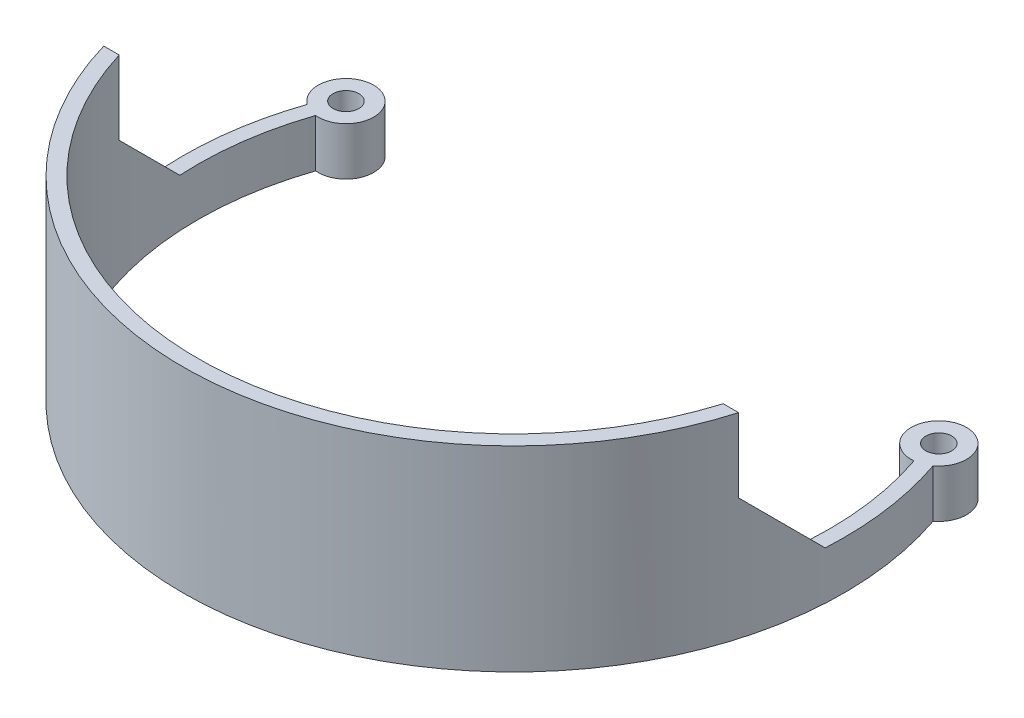
ISO-10303-21;
HEADER;
FILE_DESCRIPTION(('STEP AP214'),'2;1');
FILE_NAME('part.step','',(''),(''),'','','');
FILE_SCHEMA(('AUTOMOTIVE_DESIGN { 1 0 10303 214 1 1 1 1 }'));
ENDSEC;
DATA;
#1=APPLICATION_CONTEXT('core data for automotive mechanical design processes');
#2=APPLICATION_PROTOCOL_DEFINITION('international standard','automotive_design',2000,#1);
#3=PRODUCT_CONTEXT('',#1,'mechanical');
#4=PRODUCT('Part','Part','',(#3));
#5=PRODUCT_RELATED_PRODUCT_CATEGORY('part','',(#4));
#6=PRODUCT_DEFINITION_FORMATION('','',#4);
#7=PRODUCT_DEFINITION_CONTEXT('part definition',#1,'design');
#8=PRODUCT_DEFINITION('design','',#6,#7);
#9=PRODUCT_DEFINITION_SHAPE('','',#8);
#10=(LENGTH_UNIT() NAMED_UNIT(*) SI_UNIT(.MILLI.,.METRE.));
#11=(NAMED_UNIT(*) PLANE_ANGLE_UNIT() SI_UNIT($,.RADIAN.));
#12=(NAMED_UNIT(*) SI_UNIT($,.STERADIAN.) SOLID_ANGLE_UNIT());
#13=UNCERTAINTY_MEASURE_WITH_UNIT(LENGTH_MEASURE(1.E-05),#10,'distance_accuracy_value','');
#14=(GEOMETRIC_REPRESENTATION_CONTEXT(3) GLOBAL_UNCERTAINTY_ASSIGNED_CONTEXT((#13)) GLOBAL_UNIT_ASSIGNED_CONTEXT((#10,
#11,#12)) REPRESENTATION_CONTEXT('',''));
#15=CARTESIAN_POINT('',(0.,0.,0.));
#16=DIRECTION('',(0.,0.,1.));
#17=DIRECTION('',(1.,0.,0.));
#18=AXIS2_PLACEMENT_3D('',#15,#16,#17);
#19=CARTESIAN_POINT('',(40.125,13.,-17.4369399551641));
#20=DIRECTION('',(0.,1.,0.));
#21=DIRECTION('',(0.,0.,1.));
#22=AXIS2_PLACEMENT_3D('',#19,#20,#21);
#23=PLANE('',#22);
#24=CARTESIAN_POINT('',(0.,13.,0.));
#25=DIRECTION('',(0.,1.,0.));
#26=DIRECTION('',(0.,0.,1.));
#27=AXIS2_PLACEMENT_3D('',#24,#25,#26);
#28=CIRCLE('',#27,85.5);
#29=CARTESIAN_POINT('',(85.3536759606755,13.,4.99999999999986));
#30=VERTEX_POINT('',#29);
#31=CARTESIAN_POINT('',(80.9872265222124,13.,-27.4102013899909));
#32=VERTEX_POINT('',#31);
#33=EDGE_CURVE('E187',#30,#32,#28,.T.);
#34=ORIENTED_EDGE('',*,*,#33,.F.);
#35=DIRECTION('',(1.,0.,0.));
#36=VECTOR('',#35,1.);
#37=CARTESIAN_POINT('',(40.125,13.,4.99999999999986));
#38=LINE('',#37,#36);
#39=CARTESIAN_POINT('',(89.3602260516389,13.,4.99999999999986));
#40=VERTEX_POINT('',#39);
#41=EDGE_CURVE('E90',#30,#40,#38,.T.);
#42=ORIENTED_EDGE('',*,*,#41,.T.);
#43=CARTESIAN_POINT('',(0.,13.,0.));
#44=DIRECTION('',(0.,1.,0.));
#45=DIRECTION('',(0.,0.,1.));
#46=AXIS2_PLACEMENT_3D('',#43,#44,#45);
#47=CIRCLE('',#46,89.5);
#48=CARTESIAN_POINT('',(84.7217087481494,13.,-28.8527653231672));
#49=VERTEX_POINT('',#48);
#50=EDGE_CURVE('E196',#40,#49,#47,.T.);
#51=ORIENTED_EDGE('',*,*,#50,.T.);
#52=CARTESIAN_POINT('',(80.25,13.,-34.8738799103283));
#53=DIRECTION('',(0.,1.,0.));
#54=DIRECTION('',(0.,0.,1.));
#55=AXIS2_PLACEMENT_3D('',#52,#53,#54);
#56=CIRCLE('',#55,7.49999999999997);
#57=EDGE_CURVE('E193',#49,#32,#56,.T.);
#58=ORIENTED_EDGE('',*,*,#57,.T.);
#59=EDGE_LOOP('',(#34,#42,#51,#58));
#60=FACE_BOUND('',#59,.T.);
#61=CARTESIAN_POINT('',(80.25,13.,-34.8738799103283));
#62=DIRECTION('',(0.,1.,0.));
#63=DIRECTION('',(0.,0.,1.));
#64=AXIS2_PLACEMENT_3D('',#61,#62,#63);
#65=CIRCLE('',#64,3.49999999999998);
#66=CARTESIAN_POINT('',(80.25,13.,-31.3738799103283));
#67=VERTEX_POINT('',#66);
#68=EDGE_CURVE('E178',#67,#67,#65,.T.);
#69=ORIENTED_EDGE('',*,*,#68,.F.);
#70=EDGE_LOOP('',(#69));
#71=FACE_BOUND('',#70,.T.);
#72=ADVANCED_FACE('F68',(#60,#71),#23,.T.);
#73=CARTESIAN_POINT('',(0.,3.,0.));
#74=DIRECTION('',(0.,1.,0.));
#75=DIRECTION('',(0.,0.,1.));
#76=AXIS2_PLACEMENT_3D('',#73,#74,#75);
#77=PLANE('',#76);
#78=CARTESIAN_POINT('',(-80.25,3.,-34.8738799103283));
#79=DIRECTION('',(0.,1.,0.));
#80=DIRECTION('',(0.,0.,1.));
#81=AXIS2_PLACEMENT_3D('',#78,#79,#80);
#82=CIRCLE('',#81,2.25);
#83=CARTESIAN_POINT('',(-80.25,3.,-32.6238799103283));
#84=VERTEX_POINT('',#83);
#85=EDGE_CURVE('E207',#84,#84,#82,.T.);
#86=ORIENTED_EDGE('',*,*,#85,.F.);
#87=EDGE_LOOP('',(#86));
#88=FACE_BOUND('',#87,.T.);
#89=CARTESIAN_POINT('',(-80.25,3.,-34.8738799103283));
#90=DIRECTION('',(0.,1.,0.));
#91=DIRECTION('',(0.,0.,1.));
#92=AXIS2_PLACEMENT_3D('',#89,#90,#91);
#93=CIRCLE('',#92,3.50000000000001);
#94=CARTESIAN_POINT('',(-80.25,3.,-31.3738799103283));
#95=VERTEX_POINT('',#94);
#96=EDGE_CURVE('E181',#95,#95,#93,.T.);
#97=ORIENTED_EDGE('',*,*,#96,.T.);
#98=EDGE_LOOP('',(#97));
#99=FACE_BOUND('',#98,.T.);
#100=ADVANCED_FACE('F282',(#88,#99),#77,.T.);
#101=CARTESIAN_POINT('',(80.25,3.,-34.8738799103283));
#102=DIRECTION('',(0.,1.,0.));
#103=DIRECTION('',(0.,0.,1.));
#104=AXIS2_PLACEMENT_3D('',#101,#102,#103);
#105=CIRCLE('',#104,2.25);
#106=CARTESIAN_POINT('',(80.25,3.,-32.6238799103283));
#107=VERTEX_POINT('',#106);
#108=EDGE_CURVE('E204',#107,#107,#105,.T.);
#109=ORIENTED_EDGE('',*,*,#108,.F.);
#110=EDGE_LOOP('',(#109));
#111=FACE_BOUND('',#110,.T.);
#112=CARTESIAN_POINT('',(80.25,3.,-34.8738799103283));
#113=DIRECTION('',(0.,1.,0.));
#114=DIRECTION('',(0.,0.,1.));
#115=AXIS2_PLACEMENT_3D('',#112,#113,#114);
#116=CIRCLE('',#115,3.49999999999998);
#117=CARTESIAN_POINT('',(80.25,3.,-31.3738799103283));
#118=VERTEX_POINT('',#117);
#119=EDGE_CURVE('E173',#118,#118,#116,.T.);
#120=ORIENTED_EDGE('',*,*,#119,.T.);
#121=EDGE_LOOP('',(#120));
#122=FACE_BOUND('',#121,.T.);
#123=ADVANCED_FACE('F287',(#111,#122),#77,.T.);
#124=CARTESIAN_POINT('',(0.,3.,0.));
#125=DIRECTION('',(0.,-1.,0.));
#126=DIRECTION('',(0.,0.,-1.));
#127=AXIS2_PLACEMENT_3D('',#124,#125,#126);
#128=CYLINDRICAL_SURFACE('',#127,85.5);
#129=CARTESIAN_POINT('',(0.,0.,0.));
#130=DIRECTION('',(0.,1.,0.));
#131=DIRECTION('',(0.,0.,1.));
#132=AXIS2_PLACEMENT_3D('',#129,#130,#131);
#133=CIRCLE('',#132,85.5);
#134=CARTESIAN_POINT('',(-80.9872265222124,0.,-27.4102013899908));
#135=VERTEX_POINT('',#134);
#136=CARTESIAN_POINT('',(80.9872265222124,0.,-27.4102013899909));
#137=VERTEX_POINT('',#136);
#138=EDGE_CURVE('E214',#135,#137,#133,.T.);
#139=ORIENTED_EDGE('',*,*,#138,.F.);
#140=DIRECTION('',(0.,-1.,0.));
#141=VECTOR('',#140,1.);
#142=CARTESIAN_POINT('',(-80.9872265222124,3.,-27.4102013899908));
#143=LINE('',#142,#141);
#144=CARTESIAN_POINT('',(-80.9872265222124,13.,-27.4102013899908));
#145=VERTEX_POINT('',#144);
#146=EDGE_CURVE('E235',#145,#135,#143,.T.);
#147=ORIENTED_EDGE('',*,*,#146,.F.);
#148=CARTESIAN_POINT('',(-85.3536759606755,13.,4.99999999999986));
#149=VERTEX_POINT('',#148);
#150=EDGE_CURVE('E190',#145,#149,#28,.T.);
#151=ORIENTED_EDGE('',*,*,#150,.T.);
#152=CARTESIAN_POINT('',(0.,8.0000000000001,0.));
#153=DIRECTION('',(0.,-0.707106781186544,0.707106781186551));
#154=DIRECTION('',(0.,-0.707106781186551,-0.707106781186544));
#155=AXIS2_PLACEMENT_3D('',#152,#153,#154);
#156=ELLIPSE('',#155,120.9152595829,85.5);
#157=CARTESIAN_POINT('',(-81.7633781102518,33.0000000000003,25.));
#158=VERTEX_POINT('',#157);
#159=EDGE_CURVE('E246',#149,#158,#156,.F.);
#160=ORIENTED_EDGE('',*,*,#159,.T.);
#161=DIRECTION('',(0.,-1.,0.));
#162=VECTOR('',#161,1.);
#163=CARTESIAN_POINT('',(-81.7633781102518,53.,25.));
#164=LINE('',#163,#162);
#165=CARTESIAN_POINT('',(-81.7633781102518,53.,25.));
#166=VERTEX_POINT('',#165);
#167=EDGE_CURVE('E166',#166,#158,#164,.T.);
#168=ORIENTED_EDGE('',*,*,#167,.F.);
#169=CARTESIAN_POINT('',(0.,53.,0.));
#170=DIRECTION('',(0.,1.,0.));
#171=DIRECTION('',(0.,0.,1.));
#172=AXIS2_PLACEMENT_3D('',#169,#170,#171);
#173=CIRCLE('',#172,85.5);
#174=CARTESIAN_POINT('',(81.7633781102518,53.,25.));
#175=VERTEX_POINT('',#174);
#176=EDGE_CURVE('E148',#166,#175,#173,.T.);
#177=ORIENTED_EDGE('',*,*,#176,.T.);
#178=DIRECTION('',(0.,-1.,0.));
#179=VECTOR('',#178,1.);
#180=CARTESIAN_POINT('',(81.7633781102518,53.,25.));
#181=LINE('',#180,#179);
#182=CARTESIAN_POINT('',(81.7633781102518,33.0000000000003,25.));
#183=VERTEX_POINT('',#182);
#184=EDGE_CURVE('E156',#175,#183,#181,.T.);
#185=ORIENTED_EDGE('',*,*,#184,.T.);
#186=CARTESIAN_POINT('',(0.,8.0000000000001,0.));
#187=DIRECTION('',(0.,-0.707106781186544,0.707106781186551));
#188=DIRECTION('',(0.,-0.707106781186551,-0.707106781186544));
#189=AXIS2_PLACEMENT_3D('',#186,#187,#188);
#190=ELLIPSE('',#189,120.9152595829,85.5);
#191=EDGE_CURVE('E77',#183,#30,#190,.F.);
#192=ORIENTED_EDGE('',*,*,#191,.T.);
#193=ORIENTED_EDGE('',*,*,#33,.T.);
#194=DIRECTION('',(0.,-1.,0.));
#195=VECTOR('',#194,1.);
#196=CARTESIAN_POINT('',(80.9872265222124,3.,-27.4102013899909));
#197=LINE('',#196,#195);
#198=EDGE_CURVE('E211',#32,#137,#197,.T.);
#199=ORIENTED_EDGE('',*,*,#198,.T.);
#200=EDGE_LOOP('',(#139,#147,#151,#160,#168,#177,#185,#192,#193,#199));
#201=FACE_BOUND('',#200,.T.);
#202=ADVANCED_FACE('F164',(#201),#128,.F.);
#203=CARTESIAN_POINT('',(-80.25,3.,-34.8738799103283));
#204=DIRECTION('',(0.,-1.,0.));
#205=DIRECTION('',(0.,0.,-1.));
#206=AXIS2_PLACEMENT_3D('',#203,#204,#205);
#207=CYLINDRICAL_SURFACE('',#206,7.5);
#208=CARTESIAN_POINT('',(-80.25,0.,-34.8738799103283));
#209=DIRECTION('',(0.,1.,0.));
#210=DIRECTION('',(0.,0.,1.));
#211=AXIS2_PLACEMENT_3D('',#208,#209,#210);
#212=CIRCLE('',#211,7.5);
#213=CARTESIAN_POINT('',(-84.7217087481493,0.,-28.8527653231671));
#214=VERTEX_POINT('',#213);
#215=EDGE_CURVE('E217',#135,#214,#212,.T.);
#216=ORIENTED_EDGE('',*,*,#215,.T.);
#217=DIRECTION('',(0.,-1.,0.));
#218=VECTOR('',#217,1.);
#219=CARTESIAN_POINT('',(-84.7217087481493,3.,-28.8527653231671));
#220=LINE('',#219,#218);
#221=CARTESIAN_POINT('',(-84.7217087481493,13.,-28.8527653231672));
#222=VERTEX_POINT('',#221);
#223=EDGE_CURVE('E232',#222,#214,#220,.T.);
#224=ORIENTED_EDGE('',*,*,#223,.F.);
#225=CARTESIAN_POINT('',(-80.25,13.,-34.8738799103283));
#226=DIRECTION('',(0.,1.,0.));
#227=DIRECTION('',(0.,0.,1.));
#228=AXIS2_PLACEMENT_3D('',#225,#226,#227);
#229=CIRCLE('',#228,7.5);
#230=EDGE_CURVE('E200',#145,#222,#229,.T.);
#231=ORIENTED_EDGE('',*,*,#230,.F.);
#232=ORIENTED_EDGE('',*,*,#146,.T.);
#233=EDGE_LOOP('',(#216,#224,#231,#232));
#234=FACE_BOUND('',#233,.T.);
#235=ADVANCED_FACE('F264',(#234),#207,.T.);
#236=CARTESIAN_POINT('',(0.,3.,0.));
#237=DIRECTION('',(0.,-1.,0.));
#238=DIRECTION('',(0.,0.,-1.));
#239=AXIS2_PLACEMENT_3D('',#236,#237,#238);
#240=CYLINDRICAL_SURFACE('',#239,89.5);
#241=CARTESIAN_POINT('',(0.,0.,0.));
#242=DIRECTION('',(0.,1.,0.));
#243=DIRECTION('',(0.,0.,1.));
#244=AXIS2_PLACEMENT_3D('',#241,#242,#243);
#245=CIRCLE('',#244,89.5);
#246=CARTESIAN_POINT('',(84.7217087481494,0.,-28.8527653231672));
#247=VERTEX_POINT('',#246);
#248=EDGE_CURVE('E220',#214,#247,#245,.T.);
#249=ORIENTED_EDGE('',*,*,#248,.T.);
#250=DIRECTION('',(0.,-1.,0.));
#251=VECTOR('',#250,1.);
#252=CARTESIAN_POINT('',(84.7217087481494,3.,-28.8527653231672));
#253=LINE('',#252,#251);
#254=EDGE_CURVE('E229',#49,#247,#253,.T.);
#255=ORIENTED_EDGE('',*,*,#254,.F.);
#256=ORIENTED_EDGE('',*,*,#50,.F.);
#257=CARTESIAN_POINT('',(0.,8.0000000000001,0.));
#258=DIRECTION('',(0.,-0.707106781186544,0.707106781186551));
#259=DIRECTION('',(0.,-0.707106781186551,-0.707106781186544));
#260=AXIS2_PLACEMENT_3D('',#257,#258,#259);
#261=ELLIPSE('',#260,126.572113832393,89.5);
#262=CARTESIAN_POINT('',(85.9374772727243,33.0000000000003,25.));
#263=VERTEX_POINT('',#262);
#264=EDGE_CURVE('E12',#40,#263,#261,.T.);
#265=ORIENTED_EDGE('',*,*,#264,.T.);
#266=DIRECTION('',(0.,-1.,0.));
#267=VECTOR('',#266,1.);
#268=CARTESIAN_POINT('',(85.9374772727243,53.,25.));
#269=LINE('',#268,#267);
#270=CARTESIAN_POINT('',(85.9374772727243,53.,25.));
#271=VERTEX_POINT('',#270);
#272=EDGE_CURVE('E160',#271,#263,#269,.T.);
#273=ORIENTED_EDGE('',*,*,#272,.F.);
#274=CARTESIAN_POINT('',(0.,53.,0.));
#275=DIRECTION('',(0.,1.,0.));
#276=DIRECTION('',(0.,0.,1.));
#277=AXIS2_PLACEMENT_3D('',#274,#275,#276);
#278=CIRCLE('',#277,89.5);
#279=CARTESIAN_POINT('',(-85.9374772727243,53.,25.));
#280=VERTEX_POINT('',#279);
#281=EDGE_CURVE('E150',#280,#271,#278,.T.);
#282=ORIENTED_EDGE('',*,*,#281,.F.);
#283=DIRECTION('',(0.,-1.,0.));
#284=VECTOR('',#283,1.);
#285=CARTESIAN_POINT('',(-85.9374772727243,53.,25.));
#286=LINE('',#285,#284);
#287=CARTESIAN_POINT('',(-85.9374772727243,33.0000000000003,25.));
#288=VERTEX_POINT('',#287);
#289=EDGE_CURVE('E174',#280,#288,#286,.T.);
#290=ORIENTED_EDGE('',*,*,#289,.T.);
#291=CARTESIAN_POINT('',(0.,8.0000000000001,0.));
#292=DIRECTION('',(0.,-0.707106781186544,0.707106781186551));
#293=DIRECTION('',(0.,-0.707106781186551,-0.707106781186544));
#294=AXIS2_PLACEMENT_3D('',#291,#292,#293);
#295=ELLIPSE('',#294,126.572113832393,89.5);
#296=CARTESIAN_POINT('',(-89.3602260516389,13.,4.99999999999986));
#297=VERTEX_POINT('',#296);
#298=EDGE_CURVE('E244',#288,#297,#295,.T.);
#299=ORIENTED_EDGE('',*,*,#298,.T.);
#300=EDGE_CURVE('E197',#222,#297,#47,.T.);
#301=ORIENTED_EDGE('',*,*,#300,.F.);
#302=ORIENTED_EDGE('',*,*,#223,.T.);
#303=EDGE_LOOP('',(#249,#255,#256,#265,#273,#282,#290,#299,#301,#302));
#304=FACE_BOUND('',#303,.T.);
#305=ADVANCED_FACE('F258',(#304),#240,.T.);
#306=CARTESIAN_POINT('',(80.25,3.,-34.8738799103283));
#307=DIRECTION('',(0.,-1.,0.));
#308=DIRECTION('',(0.,0.,-1.));
#309=AXIS2_PLACEMENT_3D('',#306,#307,#308);
#310=CYLINDRICAL_SURFACE('',#309,7.49999999999997);
#311=CARTESIAN_POINT('',(80.25,0.,-34.8738799103283));
#312=DIRECTION('',(0.,1.,0.));
#313=DIRECTION('',(0.,0.,1.));
#314=AXIS2_PLACEMENT_3D('',#311,#312,#313);
#315=CIRCLE('',#314,7.49999999999997);
#316=EDGE_CURVE('E223',#247,#137,#315,.T.);
#317=ORIENTED_EDGE('',*,*,#316,.T.);
#318=ORIENTED_EDGE('',*,*,#198,.F.);
#319=ORIENTED_EDGE('',*,*,#57,.F.);
#320=ORIENTED_EDGE('',*,*,#254,.T.);
#321=EDGE_LOOP('',(#317,#318,#319,#320));
#322=FACE_BOUND('',#321,.T.);
#323=ADVANCED_FACE('F273',(#322),#310,.T.);
#324=CARTESIAN_POINT('',(80.25,3.,-34.8738799103283));
#325=DIRECTION('',(0.,-1.,0.));
#326=DIRECTION('',(0.,0.,-1.));
#327=AXIS2_PLACEMENT_3D('',#324,#325,#326);
#328=CYLINDRICAL_SURFACE('',#327,2.25);
#329=ORIENTED_EDGE('',*,*,#108,.T.);
#330=EDGE_LOOP('',(#329));
#331=FACE_BOUND('',#330,.T.);
#332=CARTESIAN_POINT('',(80.25,0.,-34.8738799103283));
#333=DIRECTION('',(0.,1.,0.));
#334=DIRECTION('',(0.,0.,1.));
#335=AXIS2_PLACEMENT_3D('',#332,#333,#334);
#336=CIRCLE('',#335,2.25);
#337=CARTESIAN_POINT('',(80.25,0.,-32.6238799103283));
#338=VERTEX_POINT('',#337);
#339=EDGE_CURVE('E203',#338,#338,#336,.T.);
#340=ORIENTED_EDGE('',*,*,#339,.F.);
#341=EDGE_LOOP('',(#340));
#342=FACE_BOUND('',#341,.T.);
#343=ADVANCED_FACE('F305',(#331,#342),#328,.F.);
#344=CARTESIAN_POINT('',(-80.25,3.,-34.8738799103283));
#345=DIRECTION('',(0.,-1.,0.));
#346=DIRECTION('',(0.,0.,-1.));
#347=AXIS2_PLACEMENT_3D('',#344,#345,#346);
#348=CYLINDRICAL_SURFACE('',#347,2.25);
#349=ORIENTED_EDGE('',*,*,#85,.T.);
#350=EDGE_LOOP('',(#349));
#351=FACE_BOUND('',#350,.T.);
#352=CARTESIAN_POINT('',(-80.25,0.,-34.8738799103283));
#353=DIRECTION('',(0.,1.,0.));
#354=DIRECTION('',(0.,0.,1.));
#355=AXIS2_PLACEMENT_3D('',#352,#353,#354);
#356=CIRCLE('',#355,2.25);
#357=CARTESIAN_POINT('',(-80.25,0.,-32.6238799103283));
#358=VERTEX_POINT('',#357);
#359=EDGE_CURVE('E208',#358,#358,#356,.T.);
#360=ORIENTED_EDGE('',*,*,#359,.F.);
#361=EDGE_LOOP('',(#360));
#362=FACE_BOUND('',#361,.T.);
#363=ADVANCED_FACE('F299',(#351,#362),#348,.F.);
#364=CARTESIAN_POINT('',(0.,0.,0.));
#365=DIRECTION('',(0.,1.,0.));
#366=DIRECTION('',(0.,0.,1.));
#367=AXIS2_PLACEMENT_3D('',#364,#365,#366);
#368=PLANE('',#367);
#369=ORIENTED_EDGE('',*,*,#339,.T.);
#370=EDGE_LOOP('',(#369));
#371=FACE_BOUND('',#370,.T.);
#372=ORIENTED_EDGE('',*,*,#138,.T.);
#373=ORIENTED_EDGE('',*,*,#316,.F.);
#374=ORIENTED_EDGE('',*,*,#248,.F.);
#375=ORIENTED_EDGE('',*,*,#215,.F.);
#376=EDGE_LOOP('',(#372,#373,#374,#375));
#377=FACE_BOUND('',#376,.T.);
#378=ORIENTED_EDGE('',*,*,#359,.T.);
#379=EDGE_LOOP('',(#378));
#380=FACE_BOUND('',#379,.T.);
#381=ADVANCED_FACE('F269',(#371,#377,#380),#368,.F.);
#382=ORIENTED_EDGE('',*,*,#300,.T.);
#383=DIRECTION('',(1.,0.,0.));
#384=VECTOR('',#383,1.);
#385=CARTESIAN_POINT('',(40.125,13.,4.99999999999986));
#386=LINE('',#385,#384);
#387=EDGE_CURVE('E240',#297,#149,#386,.T.);
#388=ORIENTED_EDGE('',*,*,#387,.T.);
#389=ORIENTED_EDGE('',*,*,#150,.F.);
#390=ORIENTED_EDGE('',*,*,#230,.T.);
#391=EDGE_LOOP('',(#382,#388,#389,#390));
#392=FACE_BOUND('',#391,.T.);
#393=CARTESIAN_POINT('',(-80.25,13.,-34.8738799103283));
#394=DIRECTION('',(0.,1.,0.));
#395=DIRECTION('',(0.,0.,1.));
#396=AXIS2_PLACEMENT_3D('',#393,#394,#395);
#397=CIRCLE('',#396,3.50000000000001);
#398=CARTESIAN_POINT('',(-80.25,13.,-31.3738799103283));
#399=VERTEX_POINT('',#398);
#400=EDGE_CURVE('E184',#399,#399,#397,.T.);
#401=ORIENTED_EDGE('',*,*,#400,.F.);
#402=EDGE_LOOP('',(#401));
#403=FACE_BOUND('',#402,.T.);
#404=ADVANCED_FACE('F260',(#392,#403),#23,.T.);
#405=CARTESIAN_POINT('',(-80.25,13.,-34.8738799103283));
#406=DIRECTION('',(0.,-1.,0.));
#407=DIRECTION('',(0.,0.,-1.));
#408=AXIS2_PLACEMENT_3D('',#405,#406,#407);
#409=CYLINDRICAL_SURFACE('',#408,3.50000000000001);
#410=ORIENTED_EDGE('',*,*,#400,.T.);
#411=EDGE_LOOP('',(#410));
#412=FACE_BOUND('',#411,.T.);
#413=ORIENTED_EDGE('',*,*,#96,.F.);
#414=EDGE_LOOP('',(#413));
#415=FACE_BOUND('',#414,.T.);
#416=ADVANCED_FACE('F292',(#412,#415),#409,.F.);
#417=CARTESIAN_POINT('',(80.25,13.,-34.8738799103283));
#418=DIRECTION('',(0.,-1.,0.));
#419=DIRECTION('',(0.,0.,-1.));
#420=AXIS2_PLACEMENT_3D('',#417,#418,#419);
#421=CYLINDRICAL_SURFACE('',#420,3.49999999999998);
#422=ORIENTED_EDGE('',*,*,#68,.T.);
#423=EDGE_LOOP('',(#422));
#424=FACE_BOUND('',#423,.T.);
#425=ORIENTED_EDGE('',*,*,#119,.F.);
#426=EDGE_LOOP('',(#425));
#427=FACE_BOUND('',#426,.T.);
#428=ADVANCED_FACE('F297',(#424,#427),#421,.F.);
#429=CARTESIAN_POINT('',(40.125,53.,25.));
#430=DIRECTION('',(0.,0.,1.));
#431=DIRECTION('',(1.,0.,0.));
#432=AXIS2_PLACEMENT_3D('',#429,#430,#431);
#433=PLANE('',#432);
#434=ORIENTED_EDGE('',*,*,#167,.T.);
#435=DIRECTION('',(-1.,0.,0.));
#436=VECTOR('',#435,1.);
#437=CARTESIAN_POINT('',(40.125,33.0000000000003,25.));
#438=LINE('',#437,#436);
#439=EDGE_CURVE('E237',#158,#288,#438,.T.);
#440=ORIENTED_EDGE('',*,*,#439,.T.);
#441=ORIENTED_EDGE('',*,*,#289,.F.);
#442=DIRECTION('',(-1.,0.,0.));
#443=VECTOR('',#442,1.);
#444=CARTESIAN_POINT('',(40.125,53.,25.));
#445=LINE('',#444,#443);
#446=EDGE_CURVE('E161',#166,#280,#445,.T.);
#447=ORIENTED_EDGE('',*,*,#446,.F.);
#448=EDGE_LOOP('',(#434,#440,#441,#447));
#449=FACE_BOUND('',#448,.T.);
#450=ADVANCED_FACE('F253',(#449),#433,.F.);
#451=CARTESIAN_POINT('',(40.125,53.,25.));
#452=DIRECTION('',(0.,0.,1.));
#453=DIRECTION('',(1.,0.,0.));
#454=AXIS2_PLACEMENT_3D('',#451,#452,#453);
#455=PLANE('',#454);
#456=ORIENTED_EDGE('',*,*,#272,.T.);
#457=DIRECTION('',(-1.,0.,0.));
#458=VECTOR('',#457,1.);
#459=CARTESIAN_POINT('',(40.125,33.0000000000003,25.));
#460=LINE('',#459,#458);
#461=EDGE_CURVE('E159',#263,#183,#460,.T.);
#462=ORIENTED_EDGE('',*,*,#461,.T.);
#463=ORIENTED_EDGE('',*,*,#184,.F.);
#464=DIRECTION('',(-1.,0.,0.));
#465=VECTOR('',#464,1.);
#466=CARTESIAN_POINT('',(40.125,53.,25.));
#467=LINE('',#466,#465);
#468=EDGE_CURVE('E144',#271,#175,#467,.T.);
#469=ORIENTED_EDGE('',*,*,#468,.F.);
#470=EDGE_LOOP('',(#456,#462,#463,#469));
#471=FACE_BOUND('',#470,.T.);
#472=ADVANCED_FACE('F157',(#471),#455,.F.);
#473=CARTESIAN_POINT('',(0.,53.,0.));
#474=DIRECTION('',(0.,1.,0.));
#475=DIRECTION('',(0.,0.,1.));
#476=AXIS2_PLACEMENT_3D('',#473,#474,#475);
#477=PLANE('',#476);
#478=ORIENTED_EDGE('',*,*,#176,.F.);
#479=ORIENTED_EDGE('',*,*,#446,.T.);
#480=ORIENTED_EDGE('',*,*,#281,.T.);
#481=ORIENTED_EDGE('',*,*,#468,.T.);
#482=EDGE_LOOP('',(#478,#479,#480,#481));
#483=FACE_BOUND('',#482,.T.);
#484=ADVANCED_FACE('F146',(#483),#477,.T.);
#485=CARTESIAN_POINT('',(40.125,33.0000000000003,25.));
#486=DIRECTION('',(0.,-0.707106781186544,0.707106781186551));
#487=DIRECTION('',(-1.,0.,0.));
#488=AXIS2_PLACEMENT_3D('',#485,#486,#487);
#489=PLANE('',#488);
#490=ORIENTED_EDGE('',*,*,#159,.F.);
#491=ORIENTED_EDGE('',*,*,#387,.F.);
#492=ORIENTED_EDGE('',*,*,#298,.F.);
#493=ORIENTED_EDGE('',*,*,#439,.F.);
#494=EDGE_LOOP('',(#490,#491,#492,#493));
#495=FACE_BOUND('',#494,.T.);
#496=ADVANCED_FACE('F255',(#495),#489,.F.);
#497=CARTESIAN_POINT('',(40.125,33.0000000000003,25.));
#498=DIRECTION('',(0.,-0.707106781186544,0.707106781186551));
#499=DIRECTION('',(-1.,0.,0.));
#500=AXIS2_PLACEMENT_3D('',#497,#498,#499);
#501=PLANE('',#500);
#502=ORIENTED_EDGE('',*,*,#264,.F.);
#503=ORIENTED_EDGE('',*,*,#41,.F.);
#504=ORIENTED_EDGE('',*,*,#191,.F.);
#505=ORIENTED_EDGE('',*,*,#461,.F.);
#506=EDGE_LOOP('',(#502,#503,#504,#505));
#507=FACE_BOUND('',#506,.T.);
#508=ADVANCED_FACE('F71',(#507),#501,.F.);
#509=CLOSED_SHELL('',(#72,#100,#123,#202,#235,#305,#323,#343,#363,#381,#404,#416,#428,#450,#472,
#484,#496,#508));
#510=MANIFOLD_SOLID_BREP('B2',#509);
#511=ADVANCED_BREP_SHAPE_REPRESENTATION('',(#18,#510),#14);
#512=SHAPE_DEFINITION_REPRESENTATION(#9,#511);
ENDSEC;
END-ISO-10303-21;
